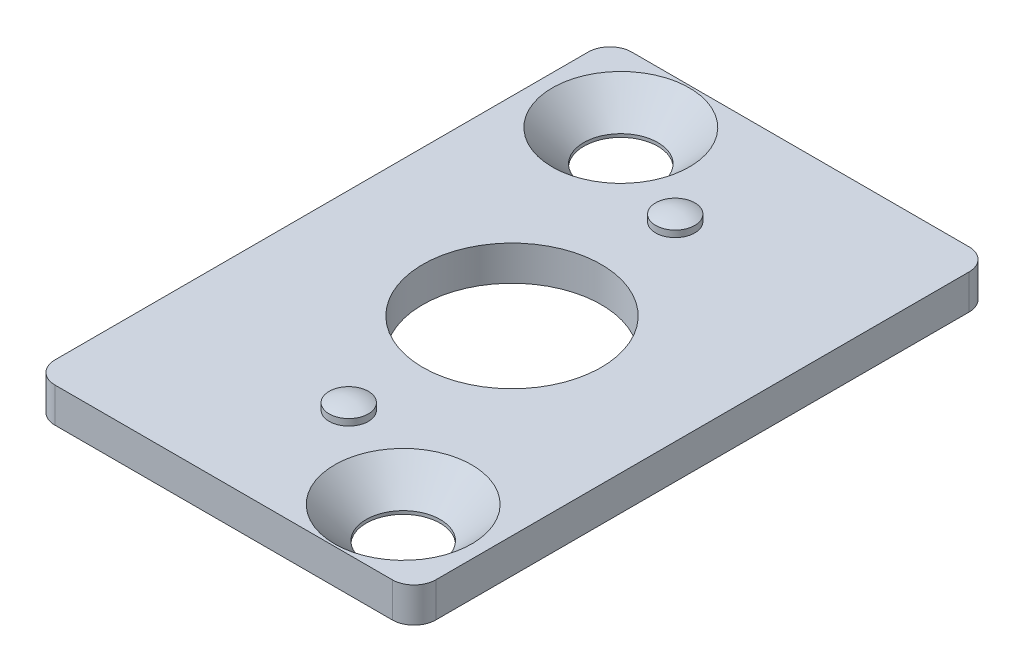
ISO-10303-21;
HEADER;
FILE_DESCRIPTION(('STEP AP214'),'2;1');
FILE_NAME('part.step','',(''),(''),'','','');
FILE_SCHEMA(('AUTOMOTIVE_DESIGN { 1 0 10303 214 1 1 1 1 }'));
ENDSEC;
DATA;
#1=APPLICATION_CONTEXT('core data for automotive mechanical design processes');
#2=APPLICATION_PROTOCOL_DEFINITION('international standard','automotive_design',2000,#1);
#3=PRODUCT_CONTEXT('',#1,'mechanical');
#4=PRODUCT('Part','Part','',(#3));
#5=PRODUCT_RELATED_PRODUCT_CATEGORY('part','',(#4));
#6=PRODUCT_DEFINITION_FORMATION('','',#4);
#7=PRODUCT_DEFINITION_CONTEXT('part definition',#1,'design');
#8=PRODUCT_DEFINITION('design','',#6,#7);
#9=PRODUCT_DEFINITION_SHAPE('','',#8);
#10=(LENGTH_UNIT() NAMED_UNIT(*) SI_UNIT(.MILLI.,.METRE.));
#11=(NAMED_UNIT(*) PLANE_ANGLE_UNIT() SI_UNIT($,.RADIAN.));
#12=(NAMED_UNIT(*) SI_UNIT($,.STERADIAN.) SOLID_ANGLE_UNIT());
#13=UNCERTAINTY_MEASURE_WITH_UNIT(LENGTH_MEASURE(1.E-05),#10,'distance_accuracy_value','');
#14=(GEOMETRIC_REPRESENTATION_CONTEXT(3) GLOBAL_UNCERTAINTY_ASSIGNED_CONTEXT((#13)) GLOBAL_UNIT_ASSIGNED_CONTEXT((#10,
#11,#12)) REPRESENTATION_CONTEXT('',''));
#15=CARTESIAN_POINT('',(0.,0.,0.));
#16=DIRECTION('',(0.,0.,1.));
#17=DIRECTION('',(1.,0.,0.));
#18=AXIS2_PLACEMENT_3D('',#15,#16,#17);
#19=CARTESIAN_POINT('',(8.75,-1.6,-13.25));
#20=DIRECTION('',(1.,0.,0.));
#21=DIRECTION('',(0.,0.,-1.));
#22=AXIS2_PLACEMENT_3D('',#19,#20,#21);
#23=PLANE('',#22);
#24=DIRECTION('',(0.,0.,-1.));
#25=VECTOR('',#24,1.);
#26=CARTESIAN_POINT('',(8.75,-1.6,-13.25));
#27=LINE('',#26,#25);
#28=CARTESIAN_POINT('',(8.75000000000001,-1.6,12.25));
#29=VERTEX_POINT('',#28);
#30=CARTESIAN_POINT('',(8.75,-1.6,-12.25));
#31=VERTEX_POINT('',#30);
#32=EDGE_CURVE('E168',#29,#31,#27,.T.);
#33=ORIENTED_EDGE('',*,*,#32,.T.);
#34=DIRECTION('',(0.,1.,0.));
#35=VECTOR('',#34,1.);
#36=CARTESIAN_POINT('',(8.75,-1.6,-12.25));
#37=LINE('',#36,#35);
#38=CARTESIAN_POINT('',(8.75,0.,-12.25));
#39=VERTEX_POINT('',#38);
#40=EDGE_CURVE('E164',#31,#39,#37,.T.);
#41=ORIENTED_EDGE('',*,*,#40,.T.);
#42=DIRECTION('',(0.,0.,-1.));
#43=VECTOR('',#42,1.);
#44=CARTESIAN_POINT('',(8.75,0.,-13.25));
#45=LINE('',#44,#43);
#46=CARTESIAN_POINT('',(8.75000000000001,0.,12.25));
#47=VERTEX_POINT('',#46);
#48=EDGE_CURVE('E112',#47,#39,#45,.T.);
#49=ORIENTED_EDGE('',*,*,#48,.F.);
#50=DIRECTION('',(0.,1.,0.));
#51=VECTOR('',#50,1.);
#52=CARTESIAN_POINT('',(8.75000000000001,-1.6,12.25));
#53=LINE('',#52,#51);
#54=EDGE_CURVE('E162',#47,#29,#53,.F.);
#55=ORIENTED_EDGE('',*,*,#54,.T.);
#56=EDGE_LOOP('',(#33,#41,#49,#55));
#57=FACE_BOUND('',#56,.T.);
#58=ADVANCED_FACE('F39',(#57),#23,.T.);
#59=CARTESIAN_POINT('',(-8.74999999999999,-1.6,13.25));
#60=DIRECTION('',(0.,0.,1.));
#61=DIRECTION('',(1.,0.,0.));
#62=AXIS2_PLACEMENT_3D('',#59,#60,#61);
#63=PLANE('',#62);
#64=DIRECTION('',(1.,0.,0.));
#65=VECTOR('',#64,1.);
#66=CARTESIAN_POINT('',(-8.74999999999999,-1.6,13.25));
#67=LINE('',#66,#65);
#68=CARTESIAN_POINT('',(-7.74999999999999,-1.6,13.25));
#69=VERTEX_POINT('',#68);
#70=CARTESIAN_POINT('',(7.75000000000001,-1.6,13.25));
#71=VERTEX_POINT('',#70);
#72=EDGE_CURVE('E141',#69,#71,#67,.T.);
#73=ORIENTED_EDGE('',*,*,#72,.T.);
#74=DIRECTION('',(0.,1.,0.));
#75=VECTOR('',#74,1.);
#76=CARTESIAN_POINT('',(7.75000000000001,-1.6,13.25));
#77=LINE('',#76,#75);
#78=CARTESIAN_POINT('',(7.75000000000001,0.,13.25));
#79=VERTEX_POINT('',#78);
#80=EDGE_CURVE('E11',#71,#79,#77,.T.);
#81=ORIENTED_EDGE('',*,*,#80,.T.);
#82=DIRECTION('',(1.,0.,0.));
#83=VECTOR('',#82,1.);
#84=CARTESIAN_POINT('',(-8.74999999999999,0.,13.25));
#85=LINE('',#84,#83);
#86=CARTESIAN_POINT('',(-7.74999999999999,0.,13.25));
#87=VERTEX_POINT('',#86);
#88=EDGE_CURVE('E170',#87,#79,#85,.T.);
#89=ORIENTED_EDGE('',*,*,#88,.F.);
#90=DIRECTION('',(0.,1.,0.));
#91=VECTOR('',#90,1.);
#92=CARTESIAN_POINT('',(-7.74999999999999,-1.6,13.25));
#93=LINE('',#92,#91);
#94=EDGE_CURVE('E47',#87,#69,#93,.F.);
#95=ORIENTED_EDGE('',*,*,#94,.T.);
#96=EDGE_LOOP('',(#73,#81,#89,#95));
#97=FACE_BOUND('',#96,.T.);
#98=ADVANCED_FACE('F251',(#97),#63,.T.);
#99=CARTESIAN_POINT('',(-8.75,-1.6,-13.25));
#100=DIRECTION('',(-1.,0.,0.));
#101=DIRECTION('',(0.,0.,1.));
#102=AXIS2_PLACEMENT_3D('',#99,#100,#101);
#103=PLANE('',#102);
#104=DIRECTION('',(0.,0.,1.));
#105=VECTOR('',#104,1.);
#106=CARTESIAN_POINT('',(-8.75,0.,-13.25));
#107=LINE('',#106,#105);
#108=CARTESIAN_POINT('',(-8.75,0.,-12.25));
#109=VERTEX_POINT('',#108);
#110=CARTESIAN_POINT('',(-8.74999999999999,0.,12.25));
#111=VERTEX_POINT('',#110);
#112=EDGE_CURVE('E129',#109,#111,#107,.T.);
#113=ORIENTED_EDGE('',*,*,#112,.F.);
#114=DIRECTION('',(0.,1.,0.));
#115=VECTOR('',#114,1.);
#116=CARTESIAN_POINT('',(-8.75,-1.6,-12.25));
#117=LINE('',#116,#115);
#118=CARTESIAN_POINT('',(-8.75,-1.6,-12.25));
#119=VERTEX_POINT('',#118);
#120=EDGE_CURVE('E153',#109,#119,#117,.F.);
#121=ORIENTED_EDGE('',*,*,#120,.T.);
#122=DIRECTION('',(0.,0.,1.));
#123=VECTOR('',#122,1.);
#124=CARTESIAN_POINT('',(-8.75,-1.6,-13.25));
#125=LINE('',#124,#123);
#126=CARTESIAN_POINT('',(-8.74999999999999,-1.6,12.25));
#127=VERTEX_POINT('',#126);
#128=EDGE_CURVE('E173',#119,#127,#125,.T.);
#129=ORIENTED_EDGE('',*,*,#128,.T.);
#130=DIRECTION('',(0.,1.,0.));
#131=VECTOR('',#130,1.);
#132=CARTESIAN_POINT('',(-8.74999999999999,-1.6,12.25));
#133=LINE('',#132,#131);
#134=EDGE_CURVE('E150',#127,#111,#133,.T.);
#135=ORIENTED_EDGE('',*,*,#134,.T.);
#136=EDGE_LOOP('',(#113,#121,#129,#135));
#137=FACE_BOUND('',#136,.T.);
#138=ADVANCED_FACE('F256',(#137),#103,.T.);
#139=CARTESIAN_POINT('',(-8.75,-1.6,-13.25));
#140=DIRECTION('',(0.,0.,-1.));
#141=DIRECTION('',(-1.,0.,0.));
#142=AXIS2_PLACEMENT_3D('',#139,#140,#141);
#143=PLANE('',#142);
#144=DIRECTION('',(-1.,0.,0.));
#145=VECTOR('',#144,1.);
#146=CARTESIAN_POINT('',(-8.75,-1.6,-13.25));
#147=LINE('',#146,#145);
#148=CARTESIAN_POINT('',(7.75,-1.6,-13.25));
#149=VERTEX_POINT('',#148);
#150=CARTESIAN_POINT('',(-7.75,-1.6,-13.25));
#151=VERTEX_POINT('',#150);
#152=EDGE_CURVE('E169',#149,#151,#147,.T.);
#153=ORIENTED_EDGE('',*,*,#152,.T.);
#154=DIRECTION('',(0.,1.,0.));
#155=VECTOR('',#154,1.);
#156=CARTESIAN_POINT('',(-7.75,-1.6,-13.25));
#157=LINE('',#156,#155);
#158=CARTESIAN_POINT('',(-7.75,0.,-13.25));
#159=VERTEX_POINT('',#158);
#160=EDGE_CURVE('E127',#151,#159,#157,.T.);
#161=ORIENTED_EDGE('',*,*,#160,.T.);
#162=DIRECTION('',(-1.,0.,0.));
#163=VECTOR('',#162,1.);
#164=CARTESIAN_POINT('',(-8.75,0.,-13.25));
#165=LINE('',#164,#163);
#166=CARTESIAN_POINT('',(7.75,0.,-13.25));
#167=VERTEX_POINT('',#166);
#168=EDGE_CURVE('E110',#167,#159,#165,.T.);
#169=ORIENTED_EDGE('',*,*,#168,.F.);
#170=DIRECTION('',(0.,1.,0.));
#171=VECTOR('',#170,1.);
#172=CARTESIAN_POINT('',(7.75,-1.6,-13.25));
#173=LINE('',#172,#171);
#174=EDGE_CURVE('E124',#167,#149,#173,.F.);
#175=ORIENTED_EDGE('',*,*,#174,.T.);
#176=EDGE_LOOP('',(#153,#161,#169,#175));
#177=FACE_BOUND('',#176,.T.);
#178=ADVANCED_FACE('F123',(#177),#143,.T.);
#179=CARTESIAN_POINT('',(0.,-1.6,0.));
#180=DIRECTION('',(0.,1.,0.));
#181=DIRECTION('',(0.,0.,1.));
#182=AXIS2_PLACEMENT_3D('',#179,#180,#181);
#183=PLANE('',#182);
#184=CARTESIAN_POINT('',(0.,-1.6,-7.5));
#185=DIRECTION('',(0.,-1.,0.));
#186=DIRECTION('',(0.,0.,-1.));
#187=AXIS2_PLACEMENT_3D('',#184,#185,#186);
#188=CIRCLE('',#187,0.899999999999999);
#189=CARTESIAN_POINT('',(0.,-1.6,-8.4));
#190=VERTEX_POINT('',#189);
#191=EDGE_CURVE('E468',#190,#190,#188,.T.);
#192=ORIENTED_EDGE('',*,*,#191,.F.);
#193=EDGE_LOOP('',(#192));
#194=FACE_BOUND('',#193,.T.);
#195=CARTESIAN_POINT('',(0.,-1.6,7.5));
#196=DIRECTION('',(0.,-1.,0.));
#197=DIRECTION('',(0.,0.,-1.));
#198=AXIS2_PLACEMENT_3D('',#195,#196,#197);
#199=CIRCLE('',#198,0.899999999999999);
#200=CARTESIAN_POINT('',(0.,-1.6,6.6));
#201=VERTEX_POINT('',#200);
#202=EDGE_CURVE('E216',#201,#201,#199,.T.);
#203=ORIENTED_EDGE('',*,*,#202,.F.);
#204=EDGE_LOOP('',(#203));
#205=FACE_BOUND('',#204,.T.);
#206=CARTESIAN_POINT('',(0.,-1.6,0.));
#207=DIRECTION('',(0.,1.,0.));
#208=DIRECTION('',(0.,0.,1.));
#209=AXIS2_PLACEMENT_3D('',#206,#207,#208);
#210=CIRCLE('',#209,4.1);
#211=CARTESIAN_POINT('',(0.,-1.6,4.1));
#212=VERTEX_POINT('',#211);
#213=EDGE_CURVE('E205',#212,#212,#210,.T.);
#214=ORIENTED_EDGE('',*,*,#213,.T.);
#215=EDGE_LOOP('',(#214));
#216=FACE_BOUND('',#215,.T.);
#217=CARTESIAN_POINT('',(-5.,-1.6,-10.));
#218=DIRECTION('',(0.,1.,0.));
#219=DIRECTION('',(0.,0.,1.));
#220=AXIS2_PLACEMENT_3D('',#217,#218,#219);
#221=CIRCLE('',#220,1.7);
#222=CARTESIAN_POINT('',(-5.,-1.6,-8.3));
#223=VERTEX_POINT('',#222);
#224=EDGE_CURVE('E192',#223,#223,#221,.T.);
#225=ORIENTED_EDGE('',*,*,#224,.T.);
#226=EDGE_LOOP('',(#225));
#227=FACE_BOUND('',#226,.T.);
#228=CARTESIAN_POINT('',(5.00000000000001,-1.6,10.));
#229=DIRECTION('',(0.,1.,0.));
#230=DIRECTION('',(0.,0.,1.));
#231=AXIS2_PLACEMENT_3D('',#228,#229,#230);
#232=CIRCLE('',#231,1.7);
#233=CARTESIAN_POINT('',(5.00000000000001,-1.6,11.7));
#234=VERTEX_POINT('',#233);
#235=EDGE_CURVE('E185',#234,#234,#232,.T.);
#236=ORIENTED_EDGE('',*,*,#235,.T.);
#237=EDGE_LOOP('',(#236));
#238=FACE_BOUND('',#237,.T.);
#239=ORIENTED_EDGE('',*,*,#128,.F.);
#240=CARTESIAN_POINT('',(-7.75,-1.6,-12.25));
#241=DIRECTION('',(0.,1.,0.));
#242=DIRECTION('',(0.,0.,1.));
#243=AXIS2_PLACEMENT_3D('',#240,#241,#242);
#244=CIRCLE('',#243,1.);
#245=EDGE_CURVE('E159',#119,#151,#244,.F.);
#246=ORIENTED_EDGE('',*,*,#245,.T.);
#247=ORIENTED_EDGE('',*,*,#152,.F.);
#248=CARTESIAN_POINT('',(7.75,-1.6,-12.25));
#249=DIRECTION('',(0.,1.,0.));
#250=DIRECTION('',(0.,0.,1.));
#251=AXIS2_PLACEMENT_3D('',#248,#249,#250);
#252=CIRCLE('',#251,1.);
#253=EDGE_CURVE('E133',#149,#31,#252,.F.);
#254=ORIENTED_EDGE('',*,*,#253,.T.);
#255=ORIENTED_EDGE('',*,*,#32,.F.);
#256=CARTESIAN_POINT('',(7.75000000000001,-1.6,12.25));
#257=DIRECTION('',(0.,1.,0.));
#258=DIRECTION('',(0.,0.,1.));
#259=AXIS2_PLACEMENT_3D('',#256,#257,#258);
#260=CIRCLE('',#259,1.);
#261=EDGE_CURVE('E54',#29,#71,#260,.F.);
#262=ORIENTED_EDGE('',*,*,#261,.T.);
#263=ORIENTED_EDGE('',*,*,#72,.F.);
#264=CARTESIAN_POINT('',(-7.74999999999999,-1.6,12.25));
#265=DIRECTION('',(0.,1.,0.));
#266=DIRECTION('',(0.,0.,1.));
#267=AXIS2_PLACEMENT_3D('',#264,#265,#266);
#268=CIRCLE('',#267,1.);
#269=EDGE_CURVE('E155',#69,#127,#268,.F.);
#270=ORIENTED_EDGE('',*,*,#269,.T.);
#271=EDGE_LOOP('',(#239,#246,#247,#254,#255,#262,#263,#270));
#272=FACE_BOUND('',#271,.T.);
#273=ADVANCED_FACE('F292',(#194,#205,#216,#227,#238,#272),#183,.F.);
#274=CARTESIAN_POINT('',(0.,0.,0.));
#275=DIRECTION('',(0.,1.,0.));
#276=DIRECTION('',(0.,0.,1.));
#277=AXIS2_PLACEMENT_3D('',#274,#275,#276);
#278=PLANE('',#277);
#279=CARTESIAN_POINT('',(0.,0.,7.5));
#280=DIRECTION('',(0.,1.,0.));
#281=DIRECTION('',(0.,0.,1.));
#282=AXIS2_PLACEMENT_3D('',#279,#280,#281);
#283=CIRCLE('',#282,0.899999999999999);
#284=CARTESIAN_POINT('',(0.,0.,8.4));
#285=VERTEX_POINT('',#284);
#286=EDGE_CURVE('E134',#285,#285,#283,.T.);
#287=ORIENTED_EDGE('',*,*,#286,.F.);
#288=EDGE_LOOP('',(#287));
#289=FACE_BOUND('',#288,.T.);
#290=CARTESIAN_POINT('',(0.,0.,-7.5));
#291=DIRECTION('',(0.,1.,0.));
#292=DIRECTION('',(0.,0.,1.));
#293=AXIS2_PLACEMENT_3D('',#290,#291,#292);
#294=CIRCLE('',#293,0.899999999999999);
#295=CARTESIAN_POINT('',(0.,0.,-6.6));
#296=VERTEX_POINT('',#295);
#297=EDGE_CURVE('E201',#296,#296,#294,.T.);
#298=ORIENTED_EDGE('',*,*,#297,.F.);
#299=EDGE_LOOP('',(#298));
#300=FACE_BOUND('',#299,.T.);
#301=CARTESIAN_POINT('',(0.,0.,0.));
#302=DIRECTION('',(0.,1.,0.));
#303=DIRECTION('',(0.,0.,1.));
#304=AXIS2_PLACEMENT_3D('',#301,#302,#303);
#305=CIRCLE('',#304,4.1);
#306=CARTESIAN_POINT('',(0.,0.,4.1));
#307=VERTEX_POINT('',#306);
#308=EDGE_CURVE('E200',#307,#307,#305,.T.);
#309=ORIENTED_EDGE('',*,*,#308,.F.);
#310=EDGE_LOOP('',(#309));
#311=FACE_BOUND('',#310,.T.);
#312=CARTESIAN_POINT('',(-5.,0.,-10.));
#313=DIRECTION('',(0.,1.,0.));
#314=DIRECTION('',(0.,0.,1.));
#315=AXIS2_PLACEMENT_3D('',#312,#313,#314);
#316=CIRCLE('',#315,3.15);
#317=CARTESIAN_POINT('',(-5.,0.,-6.85));
#318=VERTEX_POINT('',#317);
#319=EDGE_CURVE('E219',#318,#318,#316,.T.);
#320=ORIENTED_EDGE('',*,*,#319,.F.);
#321=EDGE_LOOP('',(#320));
#322=FACE_BOUND('',#321,.T.);
#323=CARTESIAN_POINT('',(5.00000000000001,0.,10.));
#324=DIRECTION('',(0.,1.,0.));
#325=DIRECTION('',(0.,0.,1.));
#326=AXIS2_PLACEMENT_3D('',#323,#324,#325);
#327=CIRCLE('',#326,3.15);
#328=CARTESIAN_POINT('',(5.00000000000001,0.,13.15));
#329=VERTEX_POINT('',#328);
#330=EDGE_CURVE('E196',#329,#329,#327,.T.);
#331=ORIENTED_EDGE('',*,*,#330,.F.);
#332=EDGE_LOOP('',(#331));
#333=FACE_BOUND('',#332,.T.);
#334=ORIENTED_EDGE('',*,*,#168,.T.);
#335=CARTESIAN_POINT('',(-7.75,0.,-12.25));
#336=DIRECTION('',(0.,1.,0.));
#337=DIRECTION('',(0.,0.,1.));
#338=AXIS2_PLACEMENT_3D('',#335,#336,#337);
#339=CIRCLE('',#338,1.);
#340=EDGE_CURVE('E117',#159,#109,#339,.T.);
#341=ORIENTED_EDGE('',*,*,#340,.T.);
#342=ORIENTED_EDGE('',*,*,#112,.T.);
#343=CARTESIAN_POINT('',(-7.74999999999999,0.,12.25));
#344=DIRECTION('',(0.,1.,0.));
#345=DIRECTION('',(0.,0.,1.));
#346=AXIS2_PLACEMENT_3D('',#343,#344,#345);
#347=CIRCLE('',#346,1.);
#348=EDGE_CURVE('E137',#111,#87,#347,.T.);
#349=ORIENTED_EDGE('',*,*,#348,.T.);
#350=ORIENTED_EDGE('',*,*,#88,.T.);
#351=CARTESIAN_POINT('',(7.75000000000001,0.,12.25));
#352=DIRECTION('',(0.,1.,0.));
#353=DIRECTION('',(0.,0.,1.));
#354=AXIS2_PLACEMENT_3D('',#351,#352,#353);
#355=CIRCLE('',#354,1.);
#356=EDGE_CURVE('E118',#79,#47,#355,.T.);
#357=ORIENTED_EDGE('',*,*,#356,.T.);
#358=ORIENTED_EDGE('',*,*,#48,.T.);
#359=CARTESIAN_POINT('',(7.75,0.,-12.25));
#360=DIRECTION('',(0.,1.,0.));
#361=DIRECTION('',(0.,0.,1.));
#362=AXIS2_PLACEMENT_3D('',#359,#360,#361);
#363=CIRCLE('',#362,1.);
#364=EDGE_CURVE('E107',#39,#167,#363,.T.);
#365=ORIENTED_EDGE('',*,*,#364,.T.);
#366=EDGE_LOOP('',(#334,#341,#342,#349,#350,#357,#358,#365));
#367=FACE_BOUND('',#366,.T.);
#368=ADVANCED_FACE('F109',(#289,#300,#311,#322,#333,#367),#278,.T.);
#369=CARTESIAN_POINT('',(5.00000000000001,0.,10.));
#370=DIRECTION('',(0.,1.,0.));
#371=DIRECTION('',(0.,0.,1.));
#372=AXIS2_PLACEMENT_3D('',#369,#370,#371);
#373=CYLINDRICAL_SURFACE('',#372,1.7);
#374=CARTESIAN_POINT('',(5.00000000000001,-1.45,10.));
#375=DIRECTION('',(0.,1.,0.));
#376=DIRECTION('',(0.,0.,1.));
#377=AXIS2_PLACEMENT_3D('',#374,#375,#376);
#378=CIRCLE('',#377,1.7);
#379=CARTESIAN_POINT('',(5.00000000000001,-1.45,11.7));
#380=VERTEX_POINT('',#379);
#381=EDGE_CURVE('E179',#380,#380,#378,.T.);
#382=ORIENTED_EDGE('',*,*,#381,.T.);
#383=EDGE_LOOP('',(#382));
#384=FACE_BOUND('',#383,.T.);
#385=ORIENTED_EDGE('',*,*,#235,.F.);
#386=EDGE_LOOP('',(#385));
#387=FACE_BOUND('',#386,.T.);
#388=ADVANCED_FACE('F235',(#384,#387),#373,.F.);
#389=CARTESIAN_POINT('',(5.00000000000001,0.,10.));
#390=DIRECTION('',(0.,1.,0.));
#391=DIRECTION('',(0.,0.,1.));
#392=AXIS2_PLACEMENT_3D('',#389,#390,#391);
#393=CONICAL_SURFACE('',#392,3.15,0.785398163397448);
#394=ORIENTED_EDGE('',*,*,#381,.F.);
#395=EDGE_LOOP('',(#394));
#396=FACE_BOUND('',#395,.T.);
#397=ORIENTED_EDGE('',*,*,#330,.T.);
#398=EDGE_LOOP('',(#397));
#399=FACE_BOUND('',#398,.T.);
#400=ADVANCED_FACE('F238',(#396,#399),#393,.F.);
#401=CARTESIAN_POINT('',(-5.,0.,-10.));
#402=DIRECTION('',(0.,1.,0.));
#403=DIRECTION('',(0.,0.,1.));
#404=AXIS2_PLACEMENT_3D('',#401,#402,#403);
#405=CYLINDRICAL_SURFACE('',#404,1.7);
#406=CARTESIAN_POINT('',(-5.,-1.45,-10.));
#407=DIRECTION('',(0.,1.,0.));
#408=DIRECTION('',(0.,0.,1.));
#409=AXIS2_PLACEMENT_3D('',#406,#407,#408);
#410=CIRCLE('',#409,1.7);
#411=CARTESIAN_POINT('',(-5.,-1.45,-8.3));
#412=VERTEX_POINT('',#411);
#413=EDGE_CURVE('E197',#412,#412,#410,.T.);
#414=ORIENTED_EDGE('',*,*,#413,.T.);
#415=EDGE_LOOP('',(#414));
#416=FACE_BOUND('',#415,.T.);
#417=ORIENTED_EDGE('',*,*,#224,.F.);
#418=EDGE_LOOP('',(#417));
#419=FACE_BOUND('',#418,.T.);
#420=ADVANCED_FACE('F240',(#416,#419),#405,.F.);
#421=CARTESIAN_POINT('',(-5.,0.,-10.));
#422=DIRECTION('',(0.,1.,0.));
#423=DIRECTION('',(0.,0.,1.));
#424=AXIS2_PLACEMENT_3D('',#421,#422,#423);
#425=CONICAL_SURFACE('',#424,3.15,0.785398163397448);
#426=ORIENTED_EDGE('',*,*,#413,.F.);
#427=EDGE_LOOP('',(#426));
#428=FACE_BOUND('',#427,.T.);
#429=ORIENTED_EDGE('',*,*,#319,.T.);
#430=EDGE_LOOP('',(#429));
#431=FACE_BOUND('',#430,.T.);
#432=ADVANCED_FACE('F246',(#428,#431),#425,.F.);
#433=CARTESIAN_POINT('',(0.,-1.6,0.));
#434=DIRECTION('',(0.,1.,0.));
#435=DIRECTION('',(0.,0.,1.));
#436=AXIS2_PLACEMENT_3D('',#433,#434,#435);
#437=CYLINDRICAL_SURFACE('',#436,4.1);
#438=ORIENTED_EDGE('',*,*,#213,.F.);
#439=EDGE_LOOP('',(#438));
#440=FACE_BOUND('',#439,.T.);
#441=ORIENTED_EDGE('',*,*,#308,.T.);
#442=EDGE_LOOP('',(#441));
#443=FACE_BOUND('',#442,.T.);
#444=ADVANCED_FACE('F337',(#440,#443),#437,.F.);
#445=CARTESIAN_POINT('',(0.,0.3,-7.5));
#446=DIRECTION('',(0.,-1.,0.));
#447=DIRECTION('',(0.,0.,-1.));
#448=AXIS2_PLACEMENT_3D('',#445,#446,#447);
#449=CYLINDRICAL_SURFACE('',#448,0.899999999999999);
#450=CARTESIAN_POINT('',(0.,0.3,-7.5));
#451=DIRECTION('',(0.,1.,0.));
#452=DIRECTION('',(0.,0.,1.));
#453=AXIS2_PLACEMENT_3D('',#450,#451,#452);
#454=CIRCLE('',#453,0.899999999999999);
#455=CARTESIAN_POINT('',(0.,0.3,-6.6));
#456=VERTEX_POINT('',#455);
#457=EDGE_CURVE('E198',#456,#456,#454,.T.);
#458=ORIENTED_EDGE('',*,*,#457,.F.);
#459=EDGE_LOOP('',(#458));
#460=FACE_BOUND('',#459,.T.);
#461=ORIENTED_EDGE('',*,*,#297,.T.);
#462=EDGE_LOOP('',(#461));
#463=FACE_BOUND('',#462,.T.);
#464=ADVANCED_FACE('F265',(#460,#463),#449,.T.);
#465=CARTESIAN_POINT('',(0.,-1.625,-7.5));
#466=DIRECTION('',(0.,0.,1.));
#467=DIRECTION('',(1.,0.,0.));
#468=AXIS2_PLACEMENT_3D('',#465,#466,#467);
#469=SPHERICAL_SURFACE('',#468,2.125);
#470=CARTESIAN_POINT('',(0.,-1.625,-7.5));
#471=DIRECTION('',(0.,1.,0.));
#472=DIRECTION('',(0.,0.,1.));
#473=AXIS2_PLACEMENT_3D('',#470,#471,#472);
#474=SPHERICAL_SURFACE('',#473,2.125);
#475=ORIENTED_EDGE('',*,*,#457,.T.);
#476=EDGE_LOOP('',(#475));
#477=FACE_BOUND('',#476,.T.);
#478=ADVANCED_FACE('F261',(#477),#474,.T.);
#479=CARTESIAN_POINT('',(0.,0.3,7.5));
#480=DIRECTION('',(0.,-1.,0.));
#481=DIRECTION('',(0.,0.,-1.));
#482=AXIS2_PLACEMENT_3D('',#479,#480,#481);
#483=CYLINDRICAL_SURFACE('',#482,0.899999999999999);
#484=CARTESIAN_POINT('',(0.,0.3,7.5));
#485=DIRECTION('',(0.,-1.,0.));
#486=DIRECTION('',(0.,0.,-1.));
#487=AXIS2_PLACEMENT_3D('',#484,#485,#486);
#488=CIRCLE('',#487,0.899999999999999);
#489=CARTESIAN_POINT('',(0.,0.3,6.6));
#490=VERTEX_POINT('',#489);
#491=EDGE_CURVE('E144',#490,#490,#488,.T.);
#492=ORIENTED_EDGE('',*,*,#491,.T.);
#493=EDGE_LOOP('',(#492));
#494=FACE_BOUND('',#493,.T.);
#495=ORIENTED_EDGE('',*,*,#286,.T.);
#496=EDGE_LOOP('',(#495));
#497=FACE_BOUND('',#496,.T.);
#498=ADVANCED_FACE('F264',(#494,#497),#483,.T.);
#499=CARTESIAN_POINT('',(0.,-1.625,7.5));
#500=DIRECTION('',(0.,0.,1.));
#501=DIRECTION('',(1.,0.,0.));
#502=AXIS2_PLACEMENT_3D('',#499,#500,#501);
#503=SPHERICAL_SURFACE('',#502,2.125);
#504=CARTESIAN_POINT('',(0.,-1.625,7.5));
#505=DIRECTION('',(0.,-1.,0.));
#506=DIRECTION('',(0.,0.,-1.));
#507=AXIS2_PLACEMENT_3D('',#504,#505,#506);
#508=SPHERICAL_SURFACE('',#507,2.125);
#509=ORIENTED_EDGE('',*,*,#491,.F.);
#510=EDGE_LOOP('',(#509));
#511=FACE_BOUND('',#510,.T.);
#512=ADVANCED_FACE('F266',(#511),#508,.T.);
#513=CARTESIAN_POINT('',(0.,-1.3,7.5));
#514=DIRECTION('',(0.,-1.,0.));
#515=DIRECTION('',(0.,0.,-1.));
#516=AXIS2_PLACEMENT_3D('',#513,#514,#515);
#517=CYLINDRICAL_SURFACE('',#516,0.899999999999999);
#518=CARTESIAN_POINT('',(0.,-1.3,7.5));
#519=DIRECTION('',(0.,-1.,0.));
#520=DIRECTION('',(0.,0.,-1.));
#521=AXIS2_PLACEMENT_3D('',#518,#519,#520);
#522=CIRCLE('',#521,0.899999999999999);
#523=CARTESIAN_POINT('',(0.,-1.3,6.6));
#524=VERTEX_POINT('',#523);
#525=EDGE_CURVE('E471',#524,#524,#522,.T.);
#526=ORIENTED_EDGE('',*,*,#525,.F.);
#527=EDGE_LOOP('',(#526));
#528=FACE_BOUND('',#527,.T.);
#529=ORIENTED_EDGE('',*,*,#202,.T.);
#530=EDGE_LOOP('',(#529));
#531=FACE_BOUND('',#530,.T.);
#532=ADVANCED_FACE('F269',(#528,#531),#517,.F.);
#533=CARTESIAN_POINT('',(0.,-1.3,7.5));
#534=DIRECTION('',(0.,-1.,0.));
#535=DIRECTION('',(0.,0.,-1.));
#536=AXIS2_PLACEMENT_3D('',#533,#534,#535);
#537=PLANE('',#536);
#538=ORIENTED_EDGE('',*,*,#525,.T.);
#539=EDGE_LOOP('',(#538));
#540=FACE_BOUND('',#539,.T.);
#541=ADVANCED_FACE('F386',(#540),#537,.T.);
#542=CARTESIAN_POINT('',(0.,-1.3,-7.5));
#543=DIRECTION('',(0.,-1.,0.));
#544=DIRECTION('',(0.,0.,-1.));
#545=AXIS2_PLACEMENT_3D('',#542,#543,#544);
#546=CYLINDRICAL_SURFACE('',#545,0.899999999999999);
#547=CARTESIAN_POINT('',(0.,-1.3,-7.5));
#548=DIRECTION('',(0.,-1.,0.));
#549=DIRECTION('',(0.,0.,-1.));
#550=AXIS2_PLACEMENT_3D('',#547,#548,#549);
#551=CIRCLE('',#550,0.899999999999999);
#552=CARTESIAN_POINT('',(0.,-1.3,-8.4));
#553=VERTEX_POINT('',#552);
#554=EDGE_CURVE('E213',#553,#553,#551,.T.);
#555=ORIENTED_EDGE('',*,*,#554,.F.);
#556=EDGE_LOOP('',(#555));
#557=FACE_BOUND('',#556,.T.);
#558=ORIENTED_EDGE('',*,*,#191,.T.);
#559=EDGE_LOOP('',(#558));
#560=FACE_BOUND('',#559,.T.);
#561=ADVANCED_FACE('F396',(#557,#560),#546,.F.);
#562=CARTESIAN_POINT('',(0.,-1.3,-7.5));
#563=DIRECTION('',(0.,-1.,0.));
#564=DIRECTION('',(0.,0.,-1.));
#565=AXIS2_PLACEMENT_3D('',#562,#563,#564);
#566=PLANE('',#565);
#567=ORIENTED_EDGE('',*,*,#554,.T.);
#568=EDGE_LOOP('',(#567));
#569=FACE_BOUND('',#568,.T.);
#570=ADVANCED_FACE('F274',(#569),#566,.T.);
#571=CARTESIAN_POINT('',(-7.75,-1.6,-12.25));
#572=DIRECTION('',(0.,1.,0.));
#573=DIRECTION('',(0.,0.,1.));
#574=AXIS2_PLACEMENT_3D('',#571,#572,#573);
#575=CYLINDRICAL_SURFACE('',#574,1.);
#576=ORIENTED_EDGE('',*,*,#245,.F.);
#577=ORIENTED_EDGE('',*,*,#120,.F.);
#578=ORIENTED_EDGE('',*,*,#340,.F.);
#579=ORIENTED_EDGE('',*,*,#160,.F.);
#580=EDGE_LOOP('',(#576,#577,#578,#579));
#581=FACE_BOUND('',#580,.T.);
#582=ADVANCED_FACE('F271',(#581),#575,.T.);
#583=CARTESIAN_POINT('',(7.75,-1.6,-12.25));
#584=DIRECTION('',(0.,1.,0.));
#585=DIRECTION('',(0.,0.,1.));
#586=AXIS2_PLACEMENT_3D('',#583,#584,#585);
#587=CYLINDRICAL_SURFACE('',#586,1.);
#588=ORIENTED_EDGE('',*,*,#253,.F.);
#589=ORIENTED_EDGE('',*,*,#174,.F.);
#590=ORIENTED_EDGE('',*,*,#364,.F.);
#591=ORIENTED_EDGE('',*,*,#40,.F.);
#592=EDGE_LOOP('',(#588,#589,#590,#591));
#593=FACE_BOUND('',#592,.T.);
#594=ADVANCED_FACE('F132',(#593),#587,.T.);
#595=CARTESIAN_POINT('',(7.75000000000001,-1.6,12.25));
#596=DIRECTION('',(0.,1.,0.));
#597=DIRECTION('',(0.,0.,1.));
#598=AXIS2_PLACEMENT_3D('',#595,#596,#597);
#599=CYLINDRICAL_SURFACE('',#598,1.);
#600=ORIENTED_EDGE('',*,*,#261,.F.);
#601=ORIENTED_EDGE('',*,*,#54,.F.);
#602=ORIENTED_EDGE('',*,*,#356,.F.);
#603=ORIENTED_EDGE('',*,*,#80,.F.);
#604=EDGE_LOOP('',(#600,#601,#602,#603));
#605=FACE_BOUND('',#604,.T.);
#606=ADVANCED_FACE('F277',(#605),#599,.T.);
#607=CARTESIAN_POINT('',(-7.74999999999999,-1.6,12.25));
#608=DIRECTION('',(0.,1.,0.));
#609=DIRECTION('',(0.,0.,1.));
#610=AXIS2_PLACEMENT_3D('',#607,#608,#609);
#611=CYLINDRICAL_SURFACE('',#610,1.);
#612=ORIENTED_EDGE('',*,*,#269,.F.);
#613=ORIENTED_EDGE('',*,*,#94,.F.);
#614=ORIENTED_EDGE('',*,*,#348,.F.);
#615=ORIENTED_EDGE('',*,*,#134,.F.);
#616=EDGE_LOOP('',(#612,#613,#614,#615));
#617=FACE_BOUND('',#616,.T.);
#618=ADVANCED_FACE('F41',(#617),#611,.T.);
#619=CLOSED_SHELL('',(#58,#98,#138,#178,#273,#368,#388,#400,#420,#432,#444,#464,#478,#498,#512,
#532,#541,#561,#570,#582,#594,#606,#618));
#620=MANIFOLD_SOLID_BREP('B2',#619);
#621=ADVANCED_BREP_SHAPE_REPRESENTATION('',(#18,#620),#14);
#622=SHAPE_DEFINITION_REPRESENTATION(#9,#621);
ENDSEC;
END-ISO-10303-21;
